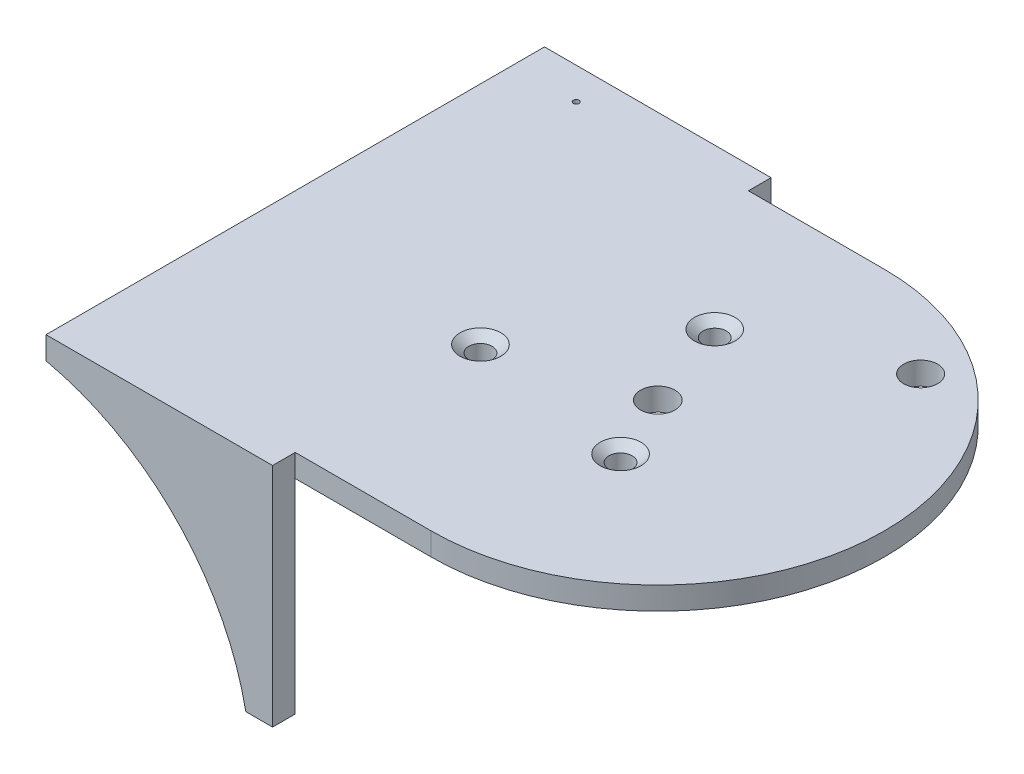
ISO-10303-21;
HEADER;
FILE_DESCRIPTION(('STEP AP214'),'2;1');
FILE_NAME('part.step','',(''),(''),'','','');
FILE_SCHEMA(('AUTOMOTIVE_DESIGN { 1 0 10303 214 1 1 1 1 }'));
ENDSEC;
DATA;
#1=APPLICATION_CONTEXT('core data for automotive mechanical design processes');
#2=APPLICATION_PROTOCOL_DEFINITION('international standard','automotive_design',2000,#1);
#3=PRODUCT_CONTEXT('',#1,'mechanical');
#4=PRODUCT('Part','Part','',(#3));
#5=PRODUCT_RELATED_PRODUCT_CATEGORY('part','',(#4));
#6=PRODUCT_DEFINITION_FORMATION('','',#4);
#7=PRODUCT_DEFINITION_CONTEXT('part definition',#1,'design');
#8=PRODUCT_DEFINITION('design','',#6,#7);
#9=PRODUCT_DEFINITION_SHAPE('','',#8);
#10=(LENGTH_UNIT() NAMED_UNIT(*) SI_UNIT(.MILLI.,.METRE.));
#11=(NAMED_UNIT(*) PLANE_ANGLE_UNIT() SI_UNIT($,.RADIAN.));
#12=(NAMED_UNIT(*) SI_UNIT($,.STERADIAN.) SOLID_ANGLE_UNIT());
#13=UNCERTAINTY_MEASURE_WITH_UNIT(LENGTH_MEASURE(1.E-05),#10,'distance_accuracy_value','');
#14=(GEOMETRIC_REPRESENTATION_CONTEXT(3) GLOBAL_UNCERTAINTY_ASSIGNED_CONTEXT((#13)) GLOBAL_UNIT_ASSIGNED_CONTEXT((#10,
#11,#12)) REPRESENTATION_CONTEXT('',''));
#15=CARTESIAN_POINT('',(0.,0.,0.));
#16=DIRECTION('',(0.,0.,1.));
#17=DIRECTION('',(1.,0.,0.));
#18=AXIS2_PLACEMENT_3D('',#15,#16,#17);
#19=CARTESIAN_POINT('',(0.,3.175,-31.75));
#20=DIRECTION('',(0.,0.,1.));
#21=DIRECTION('',(1.,0.,0.));
#22=AXIS2_PLACEMENT_3D('',#19,#20,#21);
#23=PLANE('',#22);
#24=DIRECTION('',(0.,-1.,0.));
#25=VECTOR('',#24,1.);
#26=CARTESIAN_POINT('',(-19.05,3.175,-31.75));
#27=LINE('',#26,#25);
#28=CARTESIAN_POINT('',(-19.05,3.175,-31.75));
#29=VERTEX_POINT('',#28);
#30=CARTESIAN_POINT('',(-19.05,0.,-31.75));
#31=VERTEX_POINT('',#30);
#32=EDGE_CURVE('E69',#29,#31,#27,.T.);
#33=ORIENTED_EDGE('',*,*,#32,.F.);
#34=DIRECTION('',(-1.,0.,0.));
#35=VECTOR('',#34,1.);
#36=CARTESIAN_POINT('',(0.,3.175,-31.75));
#37=LINE('',#36,#35);
#38=CARTESIAN_POINT('',(0.,3.175,-31.75));
#39=VERTEX_POINT('',#38);
#40=EDGE_CURVE('E320',#39,#29,#37,.T.);
#41=ORIENTED_EDGE('',*,*,#40,.F.);
#42=DIRECTION('',(0.,-1.,0.));
#43=VECTOR('',#42,1.);
#44=CARTESIAN_POINT('',(0.,3.175,-31.75));
#45=LINE('',#44,#43);
#46=CARTESIAN_POINT('',(0.,0.,-31.75));
#47=VERTEX_POINT('',#46);
#48=EDGE_CURVE('E11',#39,#47,#45,.T.);
#49=ORIENTED_EDGE('',*,*,#48,.T.);
#50=DIRECTION('',(-1.,0.,0.));
#51=VECTOR('',#50,1.);
#52=CARTESIAN_POINT('',(0.,0.,-31.75));
#53=LINE('',#52,#51);
#54=EDGE_CURVE('E333',#47,#31,#53,.T.);
#55=ORIENTED_EDGE('',*,*,#54,.T.);
#56=EDGE_LOOP('',(#33,#41,#49,#55));
#57=FACE_BOUND('',#56,.T.);
#58=ADVANCED_FACE('F39',(#57),#23,.F.);
#59=CARTESIAN_POINT('',(0.,3.175,0.));
#60=DIRECTION('',(0.,-1.,0.));
#61=DIRECTION('',(0.,0.,-1.));
#62=AXIS2_PLACEMENT_3D('',#59,#60,#61);
#63=CYLINDRICAL_SURFACE('',#62,31.75);
#64=CARTESIAN_POINT('',(0.,0.,0.));
#65=DIRECTION('',(0.,1.,0.));
#66=DIRECTION('',(0.,0.,1.));
#67=AXIS2_PLACEMENT_3D('',#64,#65,#66);
#68=CIRCLE('',#67,31.75);
#69=CARTESIAN_POINT('',(0.,0.,31.75));
#70=VERTEX_POINT('',#69);
#71=EDGE_CURVE('E312',#70,#47,#68,.T.);
#72=ORIENTED_EDGE('',*,*,#71,.T.);
#73=ORIENTED_EDGE('',*,*,#48,.F.);
#74=CARTESIAN_POINT('',(0.,3.175,0.));
#75=DIRECTION('',(0.,1.,0.));
#76=DIRECTION('',(0.,0.,1.));
#77=AXIS2_PLACEMENT_3D('',#74,#75,#76);
#78=CIRCLE('',#77,31.75);
#79=CARTESIAN_POINT('',(0.,3.175,31.75));
#80=VERTEX_POINT('',#79);
#81=EDGE_CURVE('E316',#80,#39,#78,.T.);
#82=ORIENTED_EDGE('',*,*,#81,.F.);
#83=DIRECTION('',(0.,-1.,0.));
#84=VECTOR('',#83,1.);
#85=CARTESIAN_POINT('',(0.,3.175,31.75));
#86=LINE('',#85,#84);
#87=EDGE_CURVE('E48',#80,#70,#86,.T.);
#88=ORIENTED_EDGE('',*,*,#87,.T.);
#89=EDGE_LOOP('',(#72,#73,#82,#88));
#90=FACE_BOUND('',#89,.T.);
#91=ADVANCED_FACE('F41',(#90),#63,.T.);
#92=CARTESIAN_POINT('',(-50.8,3.175,-31.75));
#93=DIRECTION('',(1.,0.,0.));
#94=DIRECTION('',(0.,0.,-1.));
#95=AXIS2_PLACEMENT_3D('',#92,#93,#94);
#96=PLANE('',#95);
#97=DIRECTION('',(0.,0.,1.));
#98=VECTOR('',#97,1.);
#99=CARTESIAN_POINT('',(-50.8,0.,-31.75));
#100=LINE('',#99,#98);
#101=CARTESIAN_POINT('',(-50.8,0.,-31.75));
#102=VERTEX_POINT('',#101);
#103=CARTESIAN_POINT('',(-50.8,0.,31.75));
#104=VERTEX_POINT('',#103);
#105=EDGE_CURVE('E161',#102,#104,#100,.T.);
#106=ORIENTED_EDGE('',*,*,#105,.T.);
#107=DIRECTION('',(0.,0.,-1.));
#108=VECTOR('',#107,1.);
#109=CARTESIAN_POINT('',(-50.8,0.,34.925));
#110=LINE('',#109,#108);
#111=CARTESIAN_POINT('',(-50.8,0.,34.925));
#112=VERTEX_POINT('',#111);
#113=EDGE_CURVE('E155',#112,#104,#110,.T.);
#114=ORIENTED_EDGE('',*,*,#113,.F.);
#115=DIRECTION('',(0.,1.,0.));
#116=VECTOR('',#115,1.);
#117=CARTESIAN_POINT('',(-50.8,3.175,34.925));
#118=LINE('',#117,#116);
#119=CARTESIAN_POINT('',(-50.8,3.175,34.925));
#120=VERTEX_POINT('',#119);
#121=EDGE_CURVE('E158',#112,#120,#118,.T.);
#122=ORIENTED_EDGE('',*,*,#121,.T.);
#123=DIRECTION('',(0.,0.,1.));
#124=VECTOR('',#123,1.);
#125=CARTESIAN_POINT('',(-50.8,3.175,-31.75));
#126=LINE('',#125,#124);
#127=CARTESIAN_POINT('',(-50.8,3.175,-34.925));
#128=VERTEX_POINT('',#127);
#129=EDGE_CURVE('E324',#128,#120,#126,.T.);
#130=ORIENTED_EDGE('',*,*,#129,.F.);
#131=DIRECTION('',(0.,1.,0.));
#132=VECTOR('',#131,1.);
#133=CARTESIAN_POINT('',(-50.8,3.175,-34.925));
#134=LINE('',#133,#132);
#135=CARTESIAN_POINT('',(-50.8,0.,-34.925));
#136=VERTEX_POINT('',#135);
#137=EDGE_CURVE('E215',#136,#128,#134,.T.);
#138=ORIENTED_EDGE('',*,*,#137,.F.);
#139=DIRECTION('',(0.,0.,1.));
#140=VECTOR('',#139,1.);
#141=CARTESIAN_POINT('',(-50.8,0.,-34.925));
#142=LINE('',#141,#140);
#143=EDGE_CURVE('E232',#136,#102,#142,.T.);
#144=ORIENTED_EDGE('',*,*,#143,.T.);
#145=EDGE_LOOP('',(#106,#114,#122,#130,#138,#144));
#146=FACE_BOUND('',#145,.T.);
#147=ADVANCED_FACE('F157',(#146),#96,.F.);
#148=CARTESIAN_POINT('',(-50.8,3.175,31.75));
#149=DIRECTION('',(0.,0.,-1.));
#150=DIRECTION('',(-1.,0.,0.));
#151=AXIS2_PLACEMENT_3D('',#148,#149,#150);
#152=PLANE('',#151);
#153=DIRECTION('',(1.,0.,0.));
#154=VECTOR('',#153,1.);
#155=CARTESIAN_POINT('',(-50.8,3.175,31.75));
#156=LINE('',#155,#154);
#157=CARTESIAN_POINT('',(-19.05,3.175,31.75));
#158=VERTEX_POINT('',#157);
#159=EDGE_CURVE('E58',#158,#80,#156,.T.);
#160=ORIENTED_EDGE('',*,*,#159,.F.);
#161=DIRECTION('',(0.,-1.,0.));
#162=VECTOR('',#161,1.);
#163=CARTESIAN_POINT('',(-19.05,3.175,31.75));
#164=LINE('',#163,#162);
#165=CARTESIAN_POINT('',(-19.05,0.,31.75));
#166=VERTEX_POINT('',#165);
#167=EDGE_CURVE('E181',#158,#166,#164,.T.);
#168=ORIENTED_EDGE('',*,*,#167,.T.);
#169=DIRECTION('',(1.,0.,0.));
#170=VECTOR('',#169,1.);
#171=CARTESIAN_POINT('',(-50.8,0.,31.75));
#172=LINE('',#171,#170);
#173=EDGE_CURVE('E338',#166,#70,#172,.T.);
#174=ORIENTED_EDGE('',*,*,#173,.T.);
#175=ORIENTED_EDGE('',*,*,#87,.F.);
#176=EDGE_LOOP('',(#160,#168,#174,#175));
#177=FACE_BOUND('',#176,.T.);
#178=ADVANCED_FACE('F359',(#177),#152,.F.);
#179=CARTESIAN_POINT('',(0.,3.175,0.));
#180=DIRECTION('',(0.,1.,0.));
#181=DIRECTION('',(0.,0.,1.));
#182=AXIS2_PLACEMENT_3D('',#179,#180,#181);
#183=PLANE('',#182);
#184=CARTESIAN_POINT('',(-41.91,3.175,-30.48));
#185=DIRECTION('',(0.,1.,0.));
#186=DIRECTION('',(0.,0.,1.));
#187=AXIS2_PLACEMENT_3D('',#184,#185,#186);
#188=CIRCLE('',#187,0.396874999999996);
#189=CARTESIAN_POINT('',(-41.91,3.175,-30.083125));
#190=VERTEX_POINT('',#189);
#191=EDGE_CURVE('E255',#190,#190,#188,.T.);
#192=ORIENTED_EDGE('',*,*,#191,.F.);
#193=EDGE_LOOP('',(#192));
#194=FACE_BOUND('',#193,.T.);
#195=CARTESIAN_POINT('',(15.24,3.175,-21.59));
#196=DIRECTION('',(0.,1.,0.));
#197=DIRECTION('',(0.,0.,1.));
#198=AXIS2_PLACEMENT_3D('',#195,#196,#197);
#199=CIRCLE('',#198,2.38125000000001);
#200=CARTESIAN_POINT('',(15.24,3.175,-19.20875));
#201=VERTEX_POINT('',#200);
#202=EDGE_CURVE('E260',#201,#201,#199,.T.);
#203=ORIENTED_EDGE('',*,*,#202,.F.);
#204=EDGE_LOOP('',(#203));
#205=FACE_BOUND('',#204,.T.);
#206=CARTESIAN_POINT('',(3.93552440882241,3.175,9.1528076737525));
#207=DIRECTION('',(0.,1.,0.));
#208=DIRECTION('',(0.,0.,1.));
#209=AXIS2_PLACEMENT_3D('',#206,#207,#208);
#210=CIRCLE('',#209,2.8575);
#211=CARTESIAN_POINT('',(3.93552440882241,3.175,12.0103076737525));
#212=VERTEX_POINT('',#211);
#213=EDGE_CURVE('E268',#212,#212,#210,.T.);
#214=ORIENTED_EDGE('',*,*,#213,.F.);
#215=EDGE_LOOP('',(#214));
#216=FACE_BOUND('',#215,.T.);
#217=CARTESIAN_POINT('',(-19.1657861345776,3.175,5.68015343565319));
#218=DIRECTION('',(0.,1.,0.));
#219=DIRECTION('',(0.,0.,1.));
#220=AXIS2_PLACEMENT_3D('',#217,#218,#219);
#221=CIRCLE('',#220,2.8575);
#222=CARTESIAN_POINT('',(-19.1657861345776,3.175,8.53765343565319));
#223=VERTEX_POINT('',#222);
#224=EDGE_CURVE('E283',#223,#223,#221,.T.);
#225=ORIENTED_EDGE('',*,*,#224,.F.);
#226=EDGE_LOOP('',(#225));
#227=FACE_BOUND('',#226,.T.);
#228=CARTESIAN_POINT('',(-4.60772407412391,3.175,-12.5898412365949));
#229=DIRECTION('',(0.,1.,0.));
#230=DIRECTION('',(0.,0.,1.));
#231=AXIS2_PLACEMENT_3D('',#228,#229,#230);
#232=CIRCLE('',#231,2.8575);
#233=CARTESIAN_POINT('',(-4.60772407412391,3.175,-9.73234123659489));
#234=VERTEX_POINT('',#233);
#235=EDGE_CURVE('E295',#234,#234,#232,.T.);
#236=ORIENTED_EDGE('',*,*,#235,.F.);
#237=EDGE_LOOP('',(#236));
#238=FACE_BOUND('',#237,.T.);
#239=CARTESIAN_POINT('',(0.,3.175,0.));
#240=DIRECTION('',(0.,1.,0.));
#241=DIRECTION('',(0.,0.,1.));
#242=AXIS2_PLACEMENT_3D('',#239,#240,#241);
#243=CIRCLE('',#242,2.413);
#244=CARTESIAN_POINT('',(0.,3.175,2.413));
#245=VERTEX_POINT('',#244);
#246=EDGE_CURVE('E307',#245,#245,#243,.T.);
#247=ORIENTED_EDGE('',*,*,#246,.F.);
#248=EDGE_LOOP('',(#247));
#249=FACE_BOUND('',#248,.T.);
#250=ORIENTED_EDGE('',*,*,#81,.T.);
#251=ORIENTED_EDGE('',*,*,#40,.T.);
#252=DIRECTION('',(0.,0.,1.));
#253=VECTOR('',#252,1.);
#254=CARTESIAN_POINT('',(-19.05,3.175,-34.925));
#255=LINE('',#254,#253);
#256=CARTESIAN_POINT('',(-19.05,3.175,-34.925));
#257=VERTEX_POINT('',#256);
#258=EDGE_CURVE('E251',#257,#29,#255,.T.);
#259=ORIENTED_EDGE('',*,*,#258,.F.);
#260=DIRECTION('',(1.,0.,0.));
#261=VECTOR('',#260,1.);
#262=CARTESIAN_POINT('',(-50.8,3.175,-34.925));
#263=LINE('',#262,#261);
#264=EDGE_CURVE('E219',#128,#257,#263,.T.);
#265=ORIENTED_EDGE('',*,*,#264,.F.);
#266=ORIENTED_EDGE('',*,*,#129,.T.);
#267=DIRECTION('',(1.,0.,0.));
#268=VECTOR('',#267,1.);
#269=CARTESIAN_POINT('',(-50.8,3.175,34.925));
#270=LINE('',#269,#268);
#271=CARTESIAN_POINT('',(-19.05,3.175,34.925));
#272=VERTEX_POINT('',#271);
#273=EDGE_CURVE('E179',#120,#272,#270,.T.);
#274=ORIENTED_EDGE('',*,*,#273,.T.);
#275=DIRECTION('',(0.,0.,-1.));
#276=VECTOR('',#275,1.);
#277=CARTESIAN_POINT('',(-19.05,3.175,34.925));
#278=LINE('',#277,#276);
#279=EDGE_CURVE('E198',#272,#158,#278,.T.);
#280=ORIENTED_EDGE('',*,*,#279,.T.);
#281=ORIENTED_EDGE('',*,*,#159,.T.);
#282=EDGE_LOOP('',(#250,#251,#259,#265,#266,#274,#280,#281));
#283=FACE_BOUND('',#282,.T.);
#284=ADVANCED_FACE('F354',(#194,#205,#216,#227,#238,#249,#283),#183,.T.);
#285=CARTESIAN_POINT('',(0.,0.,0.));
#286=DIRECTION('',(0.,1.,0.));
#287=DIRECTION('',(0.,0.,1.));
#288=AXIS2_PLACEMENT_3D('',#285,#286,#287);
#289=PLANE('',#288);
#290=CARTESIAN_POINT('',(-41.91,0.,-30.48));
#291=DIRECTION('',(0.,1.,0.));
#292=DIRECTION('',(0.,0.,1.));
#293=AXIS2_PLACEMENT_3D('',#290,#291,#292);
#294=CIRCLE('',#293,0.396874999999996);
#295=CARTESIAN_POINT('',(-41.91,0.,-30.083125));
#296=VERTEX_POINT('',#295);
#297=EDGE_CURVE('E256',#296,#296,#294,.T.);
#298=ORIENTED_EDGE('',*,*,#297,.T.);
#299=EDGE_LOOP('',(#298));
#300=FACE_BOUND('',#299,.T.);
#301=CARTESIAN_POINT('',(15.24,0.,-21.59));
#302=DIRECTION('',(0.,1.,0.));
#303=DIRECTION('',(0.,0.,1.));
#304=AXIS2_PLACEMENT_3D('',#301,#302,#303);
#305=CIRCLE('',#304,2.38125000000001);
#306=CARTESIAN_POINT('',(15.24,0.,-19.20875));
#307=VERTEX_POINT('',#306);
#308=EDGE_CURVE('E264',#307,#307,#305,.T.);
#309=ORIENTED_EDGE('',*,*,#308,.T.);
#310=EDGE_LOOP('',(#309));
#311=FACE_BOUND('',#310,.T.);
#312=CARTESIAN_POINT('',(3.93552440882241,0.,9.1528076737525));
#313=DIRECTION('',(0.,1.,0.));
#314=DIRECTION('',(0.,0.,1.));
#315=AXIS2_PLACEMENT_3D('',#312,#313,#314);
#316=CIRCLE('',#315,1.63195);
#317=CARTESIAN_POINT('',(3.93552440882241,0.,10.7847576737525));
#318=VERTEX_POINT('',#317);
#319=EDGE_CURVE('E279',#318,#318,#316,.T.);
#320=ORIENTED_EDGE('',*,*,#319,.T.);
#321=EDGE_LOOP('',(#320));
#322=FACE_BOUND('',#321,.T.);
#323=CARTESIAN_POINT('',(-19.1657861345776,0.,5.68015343565319));
#324=DIRECTION('',(0.,1.,0.));
#325=DIRECTION('',(0.,0.,1.));
#326=AXIS2_PLACEMENT_3D('',#323,#324,#325);
#327=CIRCLE('',#326,1.63195);
#328=CARTESIAN_POINT('',(-19.1657861345776,0.,7.31210343565319));
#329=VERTEX_POINT('',#328);
#330=EDGE_CURVE('E291',#329,#329,#327,.T.);
#331=ORIENTED_EDGE('',*,*,#330,.T.);
#332=EDGE_LOOP('',(#331));
#333=FACE_BOUND('',#332,.T.);
#334=CARTESIAN_POINT('',(-4.60772407412391,0.,-12.5898412365949));
#335=DIRECTION('',(0.,1.,0.));
#336=DIRECTION('',(0.,0.,1.));
#337=AXIS2_PLACEMENT_3D('',#334,#335,#336);
#338=CIRCLE('',#337,1.63195);
#339=CARTESIAN_POINT('',(-4.60772407412391,0.,-10.9578912365949));
#340=VERTEX_POINT('',#339);
#341=EDGE_CURVE('E303',#340,#340,#338,.T.);
#342=ORIENTED_EDGE('',*,*,#341,.T.);
#343=EDGE_LOOP('',(#342));
#344=FACE_BOUND('',#343,.T.);
#345=CARTESIAN_POINT('',(0.,0.,0.));
#346=DIRECTION('',(0.,1.,0.));
#347=DIRECTION('',(0.,0.,1.));
#348=AXIS2_PLACEMENT_3D('',#345,#346,#347);
#349=CIRCLE('',#348,2.413);
#350=CARTESIAN_POINT('',(0.,0.,2.413));
#351=VERTEX_POINT('',#350);
#352=EDGE_CURVE('E308',#351,#351,#349,.T.);
#353=ORIENTED_EDGE('',*,*,#352,.T.);
#354=EDGE_LOOP('',(#353));
#355=FACE_BOUND('',#354,.T.);
#356=ORIENTED_EDGE('',*,*,#71,.F.);
#357=ORIENTED_EDGE('',*,*,#173,.F.);
#358=EDGE_CURVE('E321',#104,#166,#172,.T.);
#359=ORIENTED_EDGE('',*,*,#358,.F.);
#360=ORIENTED_EDGE('',*,*,#105,.F.);
#361=EDGE_CURVE('E332',#31,#102,#53,.T.);
#362=ORIENTED_EDGE('',*,*,#361,.F.);
#363=ORIENTED_EDGE('',*,*,#54,.F.);
#364=EDGE_LOOP('',(#356,#357,#359,#360,#362,#363));
#365=FACE_BOUND('',#364,.T.);
#366=ADVANCED_FACE('F349',(#300,#311,#322,#333,#344,#355,#365),#289,.F.);
#367=CARTESIAN_POINT('',(0.,0.,0.));
#368=DIRECTION('',(0.,1.,0.));
#369=DIRECTION('',(0.,0.,1.));
#370=AXIS2_PLACEMENT_3D('',#367,#368,#369);
#371=CYLINDRICAL_SURFACE('',#370,2.413);
#372=ORIENTED_EDGE('',*,*,#352,.F.);
#373=EDGE_LOOP('',(#372));
#374=FACE_BOUND('',#373,.T.);
#375=ORIENTED_EDGE('',*,*,#246,.T.);
#376=EDGE_LOOP('',(#375));
#377=FACE_BOUND('',#376,.T.);
#378=ADVANCED_FACE('F405',(#374,#377),#371,.F.);
#379=CARTESIAN_POINT('',(-4.60772407412391,3.175,-12.5898412365949));
#380=DIRECTION('',(0.,1.,0.));
#381=DIRECTION('',(0.,0.,1.));
#382=AXIS2_PLACEMENT_3D('',#379,#380,#381);
#383=CYLINDRICAL_SURFACE('',#382,1.63195);
#384=ORIENTED_EDGE('',*,*,#341,.F.);
#385=EDGE_LOOP('',(#384));
#386=FACE_BOUND('',#385,.T.);
#387=CARTESIAN_POINT('',(-4.60772407412391,2.14664144701069,-12.5898412365949));
#388=DIRECTION('',(0.,1.,0.));
#389=DIRECTION('',(0.,0.,1.));
#390=AXIS2_PLACEMENT_3D('',#387,#388,#389);
#391=CIRCLE('',#390,1.63195);
#392=CARTESIAN_POINT('',(-4.60772407412391,2.14664144701069,-10.9578912365949));
#393=VERTEX_POINT('',#392);
#394=EDGE_CURVE('E299',#393,#393,#391,.T.);
#395=ORIENTED_EDGE('',*,*,#394,.T.);
#396=EDGE_LOOP('',(#395));
#397=FACE_BOUND('',#396,.T.);
#398=ADVANCED_FACE('F412',(#386,#397),#383,.F.);
#399=CARTESIAN_POINT('',(-4.60772407412391,3.175,-12.5898412365949));
#400=DIRECTION('',(0.,1.,0.));
#401=DIRECTION('',(0.,0.,1.));
#402=AXIS2_PLACEMENT_3D('',#399,#400,#401);
#403=CONICAL_SURFACE('',#402,2.8575,0.872664625997166);
#404=ORIENTED_EDGE('',*,*,#394,.F.);
#405=EDGE_LOOP('',(#404));
#406=FACE_BOUND('',#405,.T.);
#407=ORIENTED_EDGE('',*,*,#235,.T.);
#408=EDGE_LOOP('',(#407));
#409=FACE_BOUND('',#408,.T.);
#410=ADVANCED_FACE('F416',(#406,#409),#403,.F.);
#411=CARTESIAN_POINT('',(-19.1657861345776,3.175,5.68015343565319));
#412=DIRECTION('',(0.,1.,0.));
#413=DIRECTION('',(0.,0.,1.));
#414=AXIS2_PLACEMENT_3D('',#411,#412,#413);
#415=CYLINDRICAL_SURFACE('',#414,1.63195);
#416=ORIENTED_EDGE('',*,*,#330,.F.);
#417=EDGE_LOOP('',(#416));
#418=FACE_BOUND('',#417,.T.);
#419=CARTESIAN_POINT('',(-19.1657861345776,2.14664144701069,5.68015343565319));
#420=DIRECTION('',(0.,1.,0.));
#421=DIRECTION('',(0.,0.,1.));
#422=AXIS2_PLACEMENT_3D('',#419,#420,#421);
#423=CIRCLE('',#422,1.63195);
#424=CARTESIAN_POINT('',(-19.1657861345776,2.14664144701069,7.31210343565319));
#425=VERTEX_POINT('',#424);
#426=EDGE_CURVE('E287',#425,#425,#423,.T.);
#427=ORIENTED_EDGE('',*,*,#426,.T.);
#428=EDGE_LOOP('',(#427));
#429=FACE_BOUND('',#428,.T.);
#430=ADVANCED_FACE('F420',(#418,#429),#415,.F.);
#431=CARTESIAN_POINT('',(-19.1657861345776,3.175,5.68015343565319));
#432=DIRECTION('',(0.,1.,0.));
#433=DIRECTION('',(0.,0.,1.));
#434=AXIS2_PLACEMENT_3D('',#431,#432,#433);
#435=CONICAL_SURFACE('',#434,2.8575,0.872664625997166);
#436=ORIENTED_EDGE('',*,*,#426,.F.);
#437=EDGE_LOOP('',(#436));
#438=FACE_BOUND('',#437,.T.);
#439=ORIENTED_EDGE('',*,*,#224,.T.);
#440=EDGE_LOOP('',(#439));
#441=FACE_BOUND('',#440,.T.);
#442=ADVANCED_FACE('F424',(#438,#441),#435,.F.);
#443=CARTESIAN_POINT('',(3.93552440882241,3.175,9.1528076737525));
#444=DIRECTION('',(0.,1.,0.));
#445=DIRECTION('',(0.,0.,1.));
#446=AXIS2_PLACEMENT_3D('',#443,#444,#445);
#447=CYLINDRICAL_SURFACE('',#446,1.63195);
#448=ORIENTED_EDGE('',*,*,#319,.F.);
#449=EDGE_LOOP('',(#448));
#450=FACE_BOUND('',#449,.T.);
#451=CARTESIAN_POINT('',(3.93552440882241,2.14664144701069,9.1528076737525));
#452=DIRECTION('',(0.,1.,0.));
#453=DIRECTION('',(0.,0.,1.));
#454=AXIS2_PLACEMENT_3D('',#451,#452,#453);
#455=CIRCLE('',#454,1.63195);
#456=CARTESIAN_POINT('',(3.93552440882241,2.14664144701069,10.7847576737525));
#457=VERTEX_POINT('',#456);
#458=EDGE_CURVE('E275',#457,#457,#455,.T.);
#459=ORIENTED_EDGE('',*,*,#458,.T.);
#460=EDGE_LOOP('',(#459));
#461=FACE_BOUND('',#460,.T.);
#462=ADVANCED_FACE('F428',(#450,#461),#447,.F.);
#463=CARTESIAN_POINT('',(3.93552440882241,3.175,9.1528076737525));
#464=DIRECTION('',(0.,1.,0.));
#465=DIRECTION('',(0.,0.,1.));
#466=AXIS2_PLACEMENT_3D('',#463,#464,#465);
#467=CONICAL_SURFACE('',#466,2.8575,0.872664625997166);
#468=ORIENTED_EDGE('',*,*,#458,.F.);
#469=EDGE_LOOP('',(#468));
#470=FACE_BOUND('',#469,.T.);
#471=ORIENTED_EDGE('',*,*,#213,.T.);
#472=EDGE_LOOP('',(#471));
#473=FACE_BOUND('',#472,.T.);
#474=ADVANCED_FACE('F432',(#470,#473),#467,.F.);
#475=CARTESIAN_POINT('',(15.24,0.,-21.59));
#476=DIRECTION('',(0.,1.,0.));
#477=DIRECTION('',(0.,0.,1.));
#478=AXIS2_PLACEMENT_3D('',#475,#476,#477);
#479=CYLINDRICAL_SURFACE('',#478,2.38125000000001);
#480=ORIENTED_EDGE('',*,*,#308,.F.);
#481=EDGE_LOOP('',(#480));
#482=FACE_BOUND('',#481,.T.);
#483=ORIENTED_EDGE('',*,*,#202,.T.);
#484=EDGE_LOOP('',(#483));
#485=FACE_BOUND('',#484,.T.);
#486=ADVANCED_FACE('F436',(#482,#485),#479,.F.);
#487=CARTESIAN_POINT('',(-41.91,0.,-30.48));
#488=DIRECTION('',(0.,1.,0.));
#489=DIRECTION('',(0.,0.,1.));
#490=AXIS2_PLACEMENT_3D('',#487,#488,#489);
#491=CYLINDRICAL_SURFACE('',#490,0.396874999999996);
#492=ORIENTED_EDGE('',*,*,#297,.F.);
#493=EDGE_LOOP('',(#492));
#494=FACE_BOUND('',#493,.T.);
#495=ORIENTED_EDGE('',*,*,#191,.T.);
#496=EDGE_LOOP('',(#495));
#497=FACE_BOUND('',#496,.T.);
#498=ADVANCED_FACE('F391',(#494,#497),#491,.F.);
#499=CARTESIAN_POINT('',(-58.6708561445547,-35.7190901277136,-31.75));
#500=DIRECTION('',(0.,0.,-1.));
#501=DIRECTION('',(-1.,0.,0.));
#502=AXIS2_PLACEMENT_3D('',#499,#500,#501);
#503=PLANE('',#502);
#504=CARTESIAN_POINT('',(-19.05,-28.575,-31.75));
#505=VERTEX_POINT('',#504);
#506=EDGE_CURVE('E168',#31,#505,#27,.T.);
#507=ORIENTED_EDGE('',*,*,#506,.F.);
#508=ORIENTED_EDGE('',*,*,#361,.T.);
#509=CARTESIAN_POINT('',(-58.6708561445547,-35.7190901277136,-31.75));
#510=DIRECTION('',(0.,0.,1.));
#511=DIRECTION('',(-1.,0.,0.));
#512=AXIS2_PLACEMENT_3D('',#509,#510,#511);
#513=CIRCLE('',#512,36.576);
#514=CARTESIAN_POINT('',(-22.799338860683,-28.575,-31.75));
#515=VERTEX_POINT('',#514);
#516=EDGE_CURVE('E220',#515,#102,#513,.T.);
#517=ORIENTED_EDGE('',*,*,#516,.F.);
#518=DIRECTION('',(-1.,0.,0.));
#519=VECTOR('',#518,1.);
#520=CARTESIAN_POINT('',(-19.05,-28.575,-31.75));
#521=LINE('',#520,#519);
#522=EDGE_CURVE('E235',#505,#515,#521,.T.);
#523=ORIENTED_EDGE('',*,*,#522,.F.);
#524=EDGE_LOOP('',(#507,#508,#517,#523));
#525=FACE_BOUND('',#524,.T.);
#526=ADVANCED_FACE('F364',(#525),#503,.F.);
#527=CARTESIAN_POINT('',(-19.05,3.175,-34.925));
#528=DIRECTION('',(-1.,0.,0.));
#529=DIRECTION('',(0.,0.,1.));
#530=AXIS2_PLACEMENT_3D('',#527,#528,#529);
#531=PLANE('',#530);
#532=ORIENTED_EDGE('',*,*,#32,.T.);
#533=ORIENTED_EDGE('',*,*,#506,.T.);
#534=DIRECTION('',(0.,0.,1.));
#535=VECTOR('',#534,1.);
#536=CARTESIAN_POINT('',(-19.05,-28.575,-34.925));
#537=LINE('',#536,#535);
#538=CARTESIAN_POINT('',(-19.05,-28.575,-34.925));
#539=VERTEX_POINT('',#538);
#540=EDGE_CURVE('E247',#539,#505,#537,.T.);
#541=ORIENTED_EDGE('',*,*,#540,.F.);
#542=DIRECTION('',(0.,-1.,0.));
#543=VECTOR('',#542,1.);
#544=CARTESIAN_POINT('',(-19.05,3.175,-34.925));
#545=LINE('',#544,#543);
#546=EDGE_CURVE('E223',#257,#539,#545,.T.);
#547=ORIENTED_EDGE('',*,*,#546,.F.);
#548=ORIENTED_EDGE('',*,*,#258,.T.);
#549=EDGE_LOOP('',(#532,#533,#541,#547,#548));
#550=FACE_BOUND('',#549,.T.);
#551=ADVANCED_FACE('F382',(#550),#531,.F.);
#552=CARTESIAN_POINT('',(-19.05,-28.575,-34.925));
#553=DIRECTION('',(0.,1.,0.));
#554=DIRECTION('',(-1.,0.,0.));
#555=AXIS2_PLACEMENT_3D('',#552,#553,#554);
#556=PLANE('',#555);
#557=ORIENTED_EDGE('',*,*,#522,.T.);
#558=DIRECTION('',(0.,0.,1.));
#559=VECTOR('',#558,1.);
#560=CARTESIAN_POINT('',(-22.799338860683,-28.575,-34.925));
#561=LINE('',#560,#559);
#562=CARTESIAN_POINT('',(-22.799338860683,-28.575,-34.925));
#563=VERTEX_POINT('',#562);
#564=EDGE_CURVE('E243',#563,#515,#561,.T.);
#565=ORIENTED_EDGE('',*,*,#564,.F.);
#566=DIRECTION('',(-1.,0.,0.));
#567=VECTOR('',#566,1.);
#568=CARTESIAN_POINT('',(-19.05,-28.575,-34.925));
#569=LINE('',#568,#567);
#570=EDGE_CURVE('E226',#539,#563,#569,.T.);
#571=ORIENTED_EDGE('',*,*,#570,.F.);
#572=ORIENTED_EDGE('',*,*,#540,.T.);
#573=EDGE_LOOP('',(#557,#565,#571,#572));
#574=FACE_BOUND('',#573,.T.);
#575=ADVANCED_FACE('F380',(#574),#556,.F.);
#576=CARTESIAN_POINT('',(-58.6708561445547,-35.7190901277136,-34.925));
#577=DIRECTION('',(0.,0.,1.));
#578=DIRECTION('',(1.,0.,0.));
#579=AXIS2_PLACEMENT_3D('',#576,#577,#578);
#580=CYLINDRICAL_SURFACE('',#579,36.576);
#581=ORIENTED_EDGE('',*,*,#516,.T.);
#582=ORIENTED_EDGE('',*,*,#143,.F.);
#583=CARTESIAN_POINT('',(-58.6708561445547,-35.7190901277136,-34.925));
#584=DIRECTION('',(0.,0.,1.));
#585=DIRECTION('',(-1.,0.,0.));
#586=AXIS2_PLACEMENT_3D('',#583,#584,#585);
#587=CIRCLE('',#586,36.576);
#588=EDGE_CURVE('E229',#563,#136,#587,.T.);
#589=ORIENTED_EDGE('',*,*,#588,.F.);
#590=ORIENTED_EDGE('',*,*,#564,.T.);
#591=EDGE_LOOP('',(#581,#582,#589,#590));
#592=FACE_BOUND('',#591,.T.);
#593=ADVANCED_FACE('F369',(#592),#580,.F.);
#594=CARTESIAN_POINT('',(-58.6708561445547,-35.7190901277136,-34.925));
#595=DIRECTION('',(0.,0.,-1.));
#596=DIRECTION('',(-1.,0.,0.));
#597=AXIS2_PLACEMENT_3D('',#594,#595,#596);
#598=PLANE('',#597);
#599=ORIENTED_EDGE('',*,*,#137,.T.);
#600=ORIENTED_EDGE('',*,*,#264,.T.);
#601=ORIENTED_EDGE('',*,*,#546,.T.);
#602=ORIENTED_EDGE('',*,*,#570,.T.);
#603=ORIENTED_EDGE('',*,*,#588,.T.);
#604=EDGE_LOOP('',(#599,#600,#601,#602,#603));
#605=FACE_BOUND('',#604,.T.);
#606=ADVANCED_FACE('F375',(#605),#598,.T.);
#607=CARTESIAN_POINT('',(-58.6708561445547,-35.7190901277136,31.75));
#608=DIRECTION('',(0.,0.,1.));
#609=DIRECTION('',(-1.,0.,0.));
#610=AXIS2_PLACEMENT_3D('',#607,#608,#609);
#611=PLANE('',#610);
#612=CARTESIAN_POINT('',(-58.6708561445547,-35.7190901277136,31.75));
#613=DIRECTION('',(0.,0.,1.));
#614=DIRECTION('',(-1.,0.,0.));
#615=AXIS2_PLACEMENT_3D('',#612,#613,#614);
#616=CIRCLE('',#615,36.576);
#617=CARTESIAN_POINT('',(-22.799338860683,-28.575,31.75));
#618=VERTEX_POINT('',#617);
#619=EDGE_CURVE('E199',#618,#104,#616,.T.);
#620=ORIENTED_EDGE('',*,*,#619,.T.);
#621=ORIENTED_EDGE('',*,*,#358,.T.);
#622=CARTESIAN_POINT('',(-19.05,-28.575,31.75));
#623=VERTEX_POINT('',#622);
#624=EDGE_CURVE('E205',#166,#623,#164,.T.);
#625=ORIENTED_EDGE('',*,*,#624,.T.);
#626=DIRECTION('',(-1.,0.,0.));
#627=VECTOR('',#626,1.);
#628=CARTESIAN_POINT('',(-19.05,-28.575,31.75));
#629=LINE('',#628,#627);
#630=EDGE_CURVE('E201',#623,#618,#629,.T.);
#631=ORIENTED_EDGE('',*,*,#630,.T.);
#632=EDGE_LOOP('',(#620,#621,#625,#631));
#633=FACE_BOUND('',#632,.T.);
#634=ADVANCED_FACE('F361',(#633),#611,.F.);
#635=CARTESIAN_POINT('',(-58.6708561445547,-35.7190901277136,34.925));
#636=DIRECTION('',(0.,0.,-1.));
#637=DIRECTION('',(-1.,0.,0.));
#638=AXIS2_PLACEMENT_3D('',#635,#636,#637);
#639=CYLINDRICAL_SURFACE('',#638,36.576);
#640=ORIENTED_EDGE('',*,*,#619,.F.);
#641=DIRECTION('',(0.,0.,-1.));
#642=VECTOR('',#641,1.);
#643=CARTESIAN_POINT('',(-22.799338860683,-28.575,34.925));
#644=LINE('',#643,#642);
#645=CARTESIAN_POINT('',(-22.799338860683,-28.575,34.925));
#646=VERTEX_POINT('',#645);
#647=EDGE_CURVE('E169',#646,#618,#644,.T.);
#648=ORIENTED_EDGE('',*,*,#647,.F.);
#649=CARTESIAN_POINT('',(-58.6708561445547,-35.7190901277136,34.925));
#650=DIRECTION('',(0.,0.,1.));
#651=DIRECTION('',(-1.,0.,0.));
#652=AXIS2_PLACEMENT_3D('',#649,#650,#651);
#653=CIRCLE('',#652,36.576);
#654=EDGE_CURVE('E175',#646,#112,#653,.T.);
#655=ORIENTED_EDGE('',*,*,#654,.T.);
#656=ORIENTED_EDGE('',*,*,#113,.T.);
#657=EDGE_LOOP('',(#640,#648,#655,#656));
#658=FACE_BOUND('',#657,.T.);
#659=ADVANCED_FACE('F183',(#658),#639,.F.);
#660=CARTESIAN_POINT('',(-19.05,-28.575,34.925));
#661=DIRECTION('',(0.,-1.,0.));
#662=DIRECTION('',(1.,0.,0.));
#663=AXIS2_PLACEMENT_3D('',#660,#661,#662);
#664=PLANE('',#663);
#665=ORIENTED_EDGE('',*,*,#630,.F.);
#666=DIRECTION('',(0.,0.,-1.));
#667=VECTOR('',#666,1.);
#668=CARTESIAN_POINT('',(-19.05,-28.575,34.925));
#669=LINE('',#668,#667);
#670=CARTESIAN_POINT('',(-19.05,-28.575,34.925));
#671=VERTEX_POINT('',#670);
#672=EDGE_CURVE('E210',#671,#623,#669,.T.);
#673=ORIENTED_EDGE('',*,*,#672,.F.);
#674=DIRECTION('',(-1.,0.,0.));
#675=VECTOR('',#674,1.);
#676=CARTESIAN_POINT('',(-19.05,-28.575,34.925));
#677=LINE('',#676,#675);
#678=EDGE_CURVE('E185',#671,#646,#677,.T.);
#679=ORIENTED_EDGE('',*,*,#678,.T.);
#680=ORIENTED_EDGE('',*,*,#647,.T.);
#681=EDGE_LOOP('',(#665,#673,#679,#680));
#682=FACE_BOUND('',#681,.T.);
#683=ADVANCED_FACE('F560',(#682),#664,.T.);
#684=CARTESIAN_POINT('',(-19.05,3.175,34.925));
#685=DIRECTION('',(1.,0.,0.));
#686=DIRECTION('',(0.,0.,-1.));
#687=AXIS2_PLACEMENT_3D('',#684,#685,#686);
#688=PLANE('',#687);
#689=ORIENTED_EDGE('',*,*,#167,.F.);
#690=ORIENTED_EDGE('',*,*,#279,.F.);
#691=DIRECTION('',(0.,-1.,0.));
#692=VECTOR('',#691,1.);
#693=CARTESIAN_POINT('',(-19.05,3.175,34.925));
#694=LINE('',#693,#692);
#695=EDGE_CURVE('E190',#272,#671,#694,.T.);
#696=ORIENTED_EDGE('',*,*,#695,.T.);
#697=ORIENTED_EDGE('',*,*,#672,.T.);
#698=ORIENTED_EDGE('',*,*,#624,.F.);
#699=EDGE_LOOP('',(#689,#690,#696,#697,#698));
#700=FACE_BOUND('',#699,.T.);
#701=ADVANCED_FACE('F358',(#700),#688,.T.);
#702=CARTESIAN_POINT('',(-58.6708561445547,-35.7190901277136,34.925));
#703=DIRECTION('',(0.,0.,1.));
#704=DIRECTION('',(-1.,0.,0.));
#705=AXIS2_PLACEMENT_3D('',#702,#703,#704);
#706=PLANE('',#705);
#707=ORIENTED_EDGE('',*,*,#121,.F.);
#708=ORIENTED_EDGE('',*,*,#654,.F.);
#709=ORIENTED_EDGE('',*,*,#678,.F.);
#710=ORIENTED_EDGE('',*,*,#695,.F.);
#711=ORIENTED_EDGE('',*,*,#273,.F.);
#712=EDGE_LOOP('',(#707,#708,#709,#710,#711));
#713=FACE_BOUND('',#712,.T.);
#714=ADVANCED_FACE('F173',(#713),#706,.T.);
#715=CLOSED_SHELL('',(#58,#91,#147,#178,#284,#366,#378,#398,#410,#430,#442,#462,#474,#486,#498,
#526,#551,#575,#593,#606,#634,#659,#683,#701,#714));
#716=MANIFOLD_SOLID_BREP('B2',#715);
#717=ADVANCED_BREP_SHAPE_REPRESENTATION('',(#18,#716),#14);
#718=SHAPE_DEFINITION_REPRESENTATION(#9,#717);
ENDSEC;
END-ISO-10303-21;
